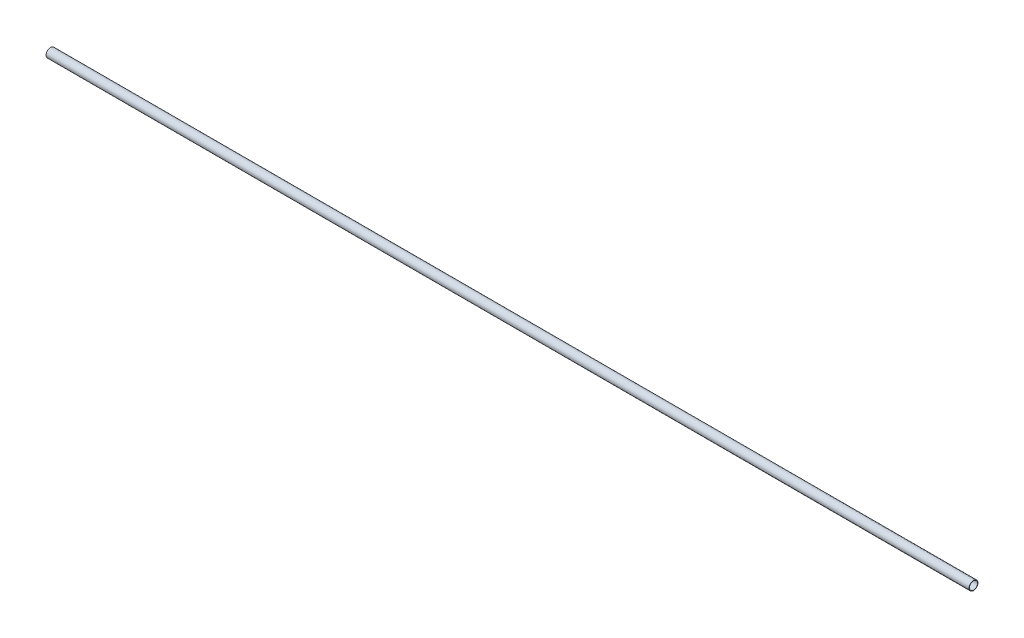
ISO-10303-21;
HEADER;
FILE_DESCRIPTION(('STEP AP214'),'2;1');
FILE_NAME('part.step','',(''),(''),'','','');
FILE_SCHEMA(('AUTOMOTIVE_DESIGN { 1 0 10303 214 1 1 1 1 }'));
ENDSEC;
DATA;
#1=APPLICATION_CONTEXT('core data for automotive mechanical design processes');
#2=APPLICATION_PROTOCOL_DEFINITION('international standard','automotive_design',2000,#1);
#3=PRODUCT_CONTEXT('',#1,'mechanical');
#4=PRODUCT('Part','Part','',(#3));
#5=PRODUCT_RELATED_PRODUCT_CATEGORY('part','',(#4));
#6=PRODUCT_DEFINITION_FORMATION('','',#4);
#7=PRODUCT_DEFINITION_CONTEXT('part definition',#1,'design');
#8=PRODUCT_DEFINITION('design','',#6,#7);
#9=PRODUCT_DEFINITION_SHAPE('','',#8);
#10=(LENGTH_UNIT() NAMED_UNIT(*) SI_UNIT(.MILLI.,.METRE.));
#11=(NAMED_UNIT(*) PLANE_ANGLE_UNIT() SI_UNIT($,.RADIAN.));
#12=(NAMED_UNIT(*) SI_UNIT($,.STERADIAN.) SOLID_ANGLE_UNIT());
#13=UNCERTAINTY_MEASURE_WITH_UNIT(LENGTH_MEASURE(1.E-05),#10,'distance_accuracy_value','');
#14=(GEOMETRIC_REPRESENTATION_CONTEXT(3) GLOBAL_UNCERTAINTY_ASSIGNED_CONTEXT((#13)) GLOBAL_UNIT_ASSIGNED_CONTEXT((#10,
#11,#12)) REPRESENTATION_CONTEXT('',''));
#15=CARTESIAN_POINT('',(0.,0.,0.));
#16=DIRECTION('',(0.,0.,1.));
#17=DIRECTION('',(1.,0.,0.));
#18=AXIS2_PLACEMENT_3D('',#15,#16,#17);
#19=CARTESIAN_POINT('',(3048.,0.,0.));
#20=DIRECTION('',(1.,0.,0.));
#21=DIRECTION('',(0.,0.,-1.));
#22=AXIS2_PLACEMENT_3D('',#19,#20,#21);
#23=PLANE('',#22);
#24=CARTESIAN_POINT('',(3048.,0.,0.));
#25=DIRECTION('',(1.,0.,0.));
#26=DIRECTION('',(0.,0.,-1.));
#27=AXIS2_PLACEMENT_3D('',#24,#25,#26);
#28=CIRCLE('',#27,14.7701);
#29=CARTESIAN_POINT('',(3048.,0.,-14.7701));
#30=VERTEX_POINT('',#29);
#31=EDGE_CURVE('E10',#30,#30,#28,.T.);
#32=ORIENTED_EDGE('',*,*,#31,.T.);
#33=EDGE_LOOP('',(#32));
#34=FACE_BOUND('',#33,.T.);
#35=CARTESIAN_POINT('',(3048.,0.,0.));
#36=DIRECTION('',(1.,0.,0.));
#37=DIRECTION('',(0.,0.,-1.));
#38=AXIS2_PLACEMENT_3D('',#35,#36,#37);
#39=CIRCLE('',#38,13.3223);
#40=CARTESIAN_POINT('',(3048.,0.,-13.3223));
#41=VERTEX_POINT('',#40);
#42=EDGE_CURVE('E42',#41,#41,#39,.T.);
#43=ORIENTED_EDGE('',*,*,#42,.F.);
#44=EDGE_LOOP('',(#43));
#45=FACE_BOUND('',#44,.T.);
#46=ADVANCED_FACE('F31',(#34,#45),#23,.T.);
#47=CARTESIAN_POINT('',(0.,0.,0.));
#48=DIRECTION('',(1.,0.,0.));
#49=DIRECTION('',(0.,0.,-1.));
#50=AXIS2_PLACEMENT_3D('',#47,#48,#49);
#51=PLANE('',#50);
#52=CARTESIAN_POINT('',(0.,0.,0.));
#53=DIRECTION('',(1.,0.,0.));
#54=DIRECTION('',(0.,0.,-1.));
#55=AXIS2_PLACEMENT_3D('',#52,#53,#54);
#56=CIRCLE('',#55,14.7701);
#57=CARTESIAN_POINT('',(0.,0.,-14.7701));
#58=VERTEX_POINT('',#57);
#59=EDGE_CURVE('E35',#58,#58,#56,.T.);
#60=ORIENTED_EDGE('',*,*,#59,.F.);
#61=EDGE_LOOP('',(#60));
#62=FACE_BOUND('',#61,.T.);
#63=CARTESIAN_POINT('',(0.,0.,0.));
#64=DIRECTION('',(1.,0.,0.));
#65=DIRECTION('',(0.,0.,-1.));
#66=AXIS2_PLACEMENT_3D('',#63,#64,#65);
#67=CIRCLE('',#66,13.3223);
#68=CARTESIAN_POINT('',(0.,0.,-13.3223));
#69=VERTEX_POINT('',#68);
#70=EDGE_CURVE('E44',#69,#69,#67,.T.);
#71=ORIENTED_EDGE('',*,*,#70,.T.);
#72=EDGE_LOOP('',(#71));
#73=FACE_BOUND('',#72,.T.);
#74=ADVANCED_FACE('F54',(#62,#73),#51,.F.);
#75=CARTESIAN_POINT('',(3048.,0.,0.));
#76=DIRECTION('',(-1.,0.,0.));
#77=DIRECTION('',(0.,0.,1.));
#78=AXIS2_PLACEMENT_3D('',#75,#76,#77);
#79=CYLINDRICAL_SURFACE('',#78,14.7701);
#80=ORIENTED_EDGE('',*,*,#31,.F.);
#81=EDGE_LOOP('',(#80));
#82=FACE_BOUND('',#81,.T.);
#83=ORIENTED_EDGE('',*,*,#59,.T.);
#84=EDGE_LOOP('',(#83));
#85=FACE_BOUND('',#84,.T.);
#86=ADVANCED_FACE('F33',(#82,#85),#79,.T.);
#87=CARTESIAN_POINT('',(3048.,0.,0.));
#88=DIRECTION('',(-1.,0.,0.));
#89=DIRECTION('',(0.,0.,1.));
#90=AXIS2_PLACEMENT_3D('',#87,#88,#89);
#91=CYLINDRICAL_SURFACE('',#90,13.3223);
#92=ORIENTED_EDGE('',*,*,#42,.T.);
#93=EDGE_LOOP('',(#92));
#94=FACE_BOUND('',#93,.T.);
#95=ORIENTED_EDGE('',*,*,#70,.F.);
#96=EDGE_LOOP('',(#95));
#97=FACE_BOUND('',#96,.T.);
#98=ADVANCED_FACE('F50',(#94,#97),#91,.F.);
#99=CLOSED_SHELL('',(#46,#74,#86,#98));
#100=MANIFOLD_SOLID_BREP('B2',#99);
#101=ADVANCED_BREP_SHAPE_REPRESENTATION('',(#18,#100),#14);
#102=SHAPE_DEFINITION_REPRESENTATION(#9,#101);
ENDSEC;
END-ISO-10303-21;
